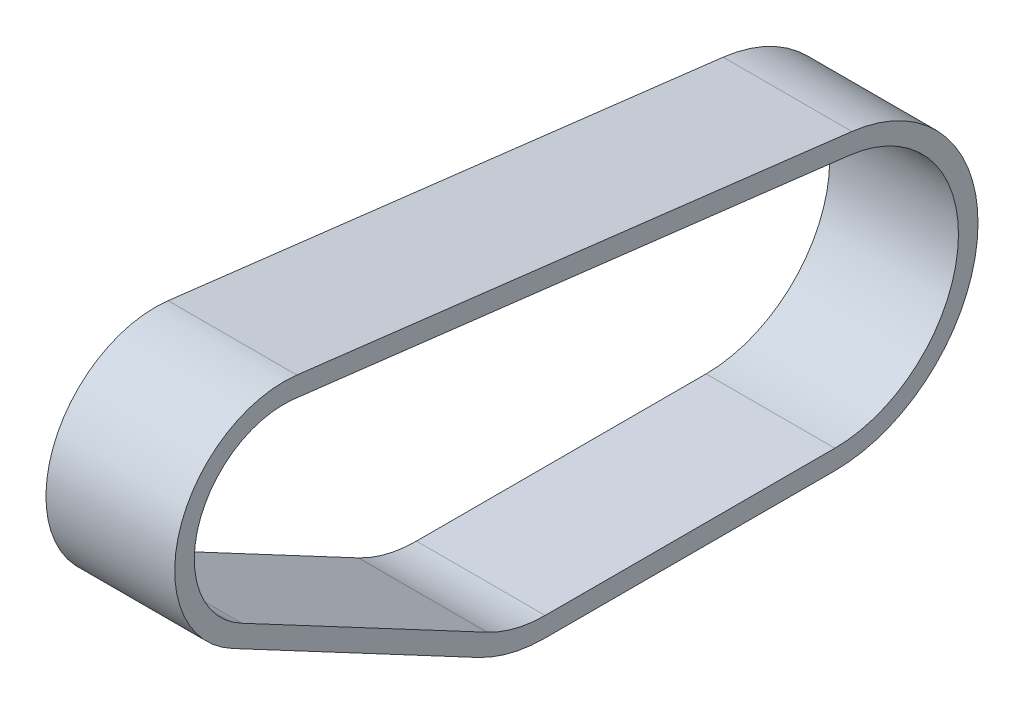
ISO-10303-21;
HEADER;
FILE_DESCRIPTION(('STEP AP214'),'2;1');
FILE_NAME('part.step','',(''),(''),'','','');
FILE_SCHEMA(('AUTOMOTIVE_DESIGN { 1 0 10303 214 1 1 1 1 }'));
ENDSEC;
DATA;
#1=APPLICATION_CONTEXT('core data for automotive mechanical design processes');
#2=APPLICATION_PROTOCOL_DEFINITION('international standard','automotive_design',2000,#1);
#3=PRODUCT_CONTEXT('',#1,'mechanical');
#4=PRODUCT('Part','Part','',(#3));
#5=PRODUCT_RELATED_PRODUCT_CATEGORY('part','',(#4));
#6=PRODUCT_DEFINITION_FORMATION('','',#4);
#7=PRODUCT_DEFINITION_CONTEXT('part definition',#1,'design');
#8=PRODUCT_DEFINITION('design','',#6,#7);
#9=PRODUCT_DEFINITION_SHAPE('','',#8);
#10=(LENGTH_UNIT() NAMED_UNIT(*) SI_UNIT(.MILLI.,.METRE.));
#11=(NAMED_UNIT(*) PLANE_ANGLE_UNIT() SI_UNIT($,.RADIAN.));
#12=(NAMED_UNIT(*) SI_UNIT($,.STERADIAN.) SOLID_ANGLE_UNIT());
#13=UNCERTAINTY_MEASURE_WITH_UNIT(LENGTH_MEASURE(1.E-05),#10,'distance_accuracy_value','');
#14=(GEOMETRIC_REPRESENTATION_CONTEXT(3) GLOBAL_UNCERTAINTY_ASSIGNED_CONTEXT((#13)) GLOBAL_UNIT_ASSIGNED_CONTEXT((#10,
#11,#12)) REPRESENTATION_CONTEXT('',''));
#15=CARTESIAN_POINT('',(0.,0.,0.));
#16=DIRECTION('',(0.,0.,1.));
#17=DIRECTION('',(1.,0.,0.));
#18=AXIS2_PLACEMENT_3D('',#15,#16,#17);
#19=CARTESIAN_POINT('',(-35.,-16.5000000000045,90.9999999999998));
#20=DIRECTION('',(1.,0.,0.));
#21=DIRECTION('',(0.,0.,-1.));
#22=AXIS2_PLACEMENT_3D('',#19,#20,#21);
#23=CYLINDRICAL_SURFACE('',#22,21.1918387948201);
#24=CARTESIAN_POINT('',(-10.,-16.5000000000045,90.9999999999998));
#25=DIRECTION('',(1.,0.,0.));
#26=DIRECTION('',(0.,0.,-1.));
#27=AXIS2_PLACEMENT_3D('',#24,#25,#26);
#28=CIRCLE('',#27,21.1918387948201);
#29=CARTESIAN_POINT('',(-10.,4.54078358631816,88.4742411874498));
#30=VERTEX_POINT('',#29);
#31=CARTESIAN_POINT('',(-10.,-35.2112908959066,100.948950925327));
#32=VERTEX_POINT('',#31);
#33=EDGE_CURVE('E167',#30,#32,#28,.T.);
#34=ORIENTED_EDGE('',*,*,#33,.F.);
#35=DIRECTION('',(1.,0.,0.));
#36=VECTOR('',#35,1.);
#37=CARTESIAN_POINT('',(-35.,4.54078358631816,88.4742411874498));
#38=LINE('',#37,#36);
#39=CARTESIAN_POINT('',(-35.,4.54078358631816,88.4742411874498));
#40=VERTEX_POINT('',#39);
#41=EDGE_CURVE('E11',#40,#30,#38,.T.);
#42=ORIENTED_EDGE('',*,*,#41,.F.);
#43=CARTESIAN_POINT('',(-35.,-16.5000000000045,90.9999999999998));
#44=DIRECTION('',(1.,0.,0.));
#45=DIRECTION('',(0.,0.,-1.));
#46=AXIS2_PLACEMENT_3D('',#43,#44,#45);
#47=CIRCLE('',#46,21.1918387948201);
#48=CARTESIAN_POINT('',(-35.,-35.2112908959066,100.948950925327));
#49=VERTEX_POINT('',#48);
#50=EDGE_CURVE('E175',#40,#49,#47,.T.);
#51=ORIENTED_EDGE('',*,*,#50,.T.);
#52=DIRECTION('',(1.,0.,0.));
#53=VECTOR('',#52,1.);
#54=CARTESIAN_POINT('',(-35.,-35.2112908959066,100.948950925327));
#55=LINE('',#54,#53);
#56=EDGE_CURVE('E36',#49,#32,#55,.T.);
#57=ORIENTED_EDGE('',*,*,#56,.T.);
#58=EDGE_LOOP('',(#34,#42,#51,#57));
#59=FACE_BOUND('',#58,.T.);
#60=ADVANCED_FACE('F33',(#59),#23,.T.);
#61=CARTESIAN_POINT('',(-35.,-8.39815811345562,-19.3133554699392));
#62=DIRECTION('',(0.,0.992872010307369,-0.11918544855897));
#63=DIRECTION('',(0.,0.11918544855897,0.992872010307369));
#64=AXIS2_PLACEMENT_3D('',#61,#62,#63);
#65=PLANE('',#64);
#66=DIRECTION('',(0.,0.11918544855897,0.992872010307369));
#67=VECTOR('',#66,1.);
#68=CARTESIAN_POINT('',(-10.,-8.39815811345562,-19.3133554699392));
#69=LINE('',#68,#67);
#70=CARTESIAN_POINT('',(-10.,-8.39815811345562,-19.3133554699392));
#71=VERTEX_POINT('',#70);
#72=EDGE_CURVE('E179',#71,#30,#69,.T.);
#73=ORIENTED_EDGE('',*,*,#72,.F.);
#74=DIRECTION('',(1.,0.,0.));
#75=VECTOR('',#74,1.);
#76=CARTESIAN_POINT('',(-35.,-8.39815811345562,-19.3133554699392));
#77=LINE('',#76,#75);
#78=CARTESIAN_POINT('',(-35.,-8.39815811345562,-19.3133554699392));
#79=VERTEX_POINT('',#78);
#80=EDGE_CURVE('E41',#79,#71,#77,.T.);
#81=ORIENTED_EDGE('',*,*,#80,.F.);
#82=DIRECTION('',(0.,0.11918544855897,0.992872010307369));
#83=VECTOR('',#82,1.);
#84=CARTESIAN_POINT('',(-35.,-8.39815811345562,-19.3133554699392));
#85=LINE('',#84,#83);
#86=EDGE_CURVE('E191',#79,#40,#85,.T.);
#87=ORIENTED_EDGE('',*,*,#86,.T.);
#88=ORIENTED_EDGE('',*,*,#41,.T.);
#89=EDGE_LOOP('',(#73,#81,#87,#88));
#90=FACE_BOUND('',#89,.T.);
#91=ADVANCED_FACE('F228',(#90),#65,.T.);
#92=CARTESIAN_POINT('',(-35.,-36.0000000000005,-16.0000000000001));
#93=DIRECTION('',(1.,0.,0.));
#94=DIRECTION('',(0.,0.,-1.));
#95=AXIS2_PLACEMENT_3D('',#92,#93,#94);
#96=CYLINDRICAL_SURFACE('',#95,27.8);
#97=CARTESIAN_POINT('',(-10.,-36.0000000000005,-16.0000000000001));
#98=DIRECTION('',(1.,0.,0.));
#99=DIRECTION('',(0.,0.,-1.));
#100=AXIS2_PLACEMENT_3D('',#97,#98,#99);
#101=CIRCLE('',#100,27.8);
#102=CARTESIAN_POINT('',(-10.,-63.8000000000005,-15.9999999999998));
#103=VERTEX_POINT('',#102);
#104=EDGE_CURVE('E205',#103,#71,#101,.T.);
#105=ORIENTED_EDGE('',*,*,#104,.F.);
#106=DIRECTION('',(1.,0.,0.));
#107=VECTOR('',#106,1.);
#108=CARTESIAN_POINT('',(-35.,-63.8000000000005,-15.9999999999998));
#109=LINE('',#108,#107);
#110=CARTESIAN_POINT('',(-35.,-63.8000000000005,-15.9999999999998));
#111=VERTEX_POINT('',#110);
#112=EDGE_CURVE('E211',#111,#103,#109,.T.);
#113=ORIENTED_EDGE('',*,*,#112,.F.);
#114=CARTESIAN_POINT('',(-35.,-36.0000000000005,-16.0000000000001));
#115=DIRECTION('',(1.,0.,0.));
#116=DIRECTION('',(0.,0.,-1.));
#117=AXIS2_PLACEMENT_3D('',#114,#115,#116);
#118=CIRCLE('',#117,27.8);
#119=EDGE_CURVE('E188',#111,#79,#118,.T.);
#120=ORIENTED_EDGE('',*,*,#119,.T.);
#121=ORIENTED_EDGE('',*,*,#80,.T.);
#122=EDGE_LOOP('',(#105,#113,#120,#121));
#123=FACE_BOUND('',#122,.T.);
#124=ADVANCED_FACE('F239',(#123),#96,.T.);
#125=CARTESIAN_POINT('',(-35.,-63.8000000000005,-15.9999999999998));
#126=DIRECTION('',(0.,-1.,0.));
#127=DIRECTION('',(0.,0.,-1.));
#128=AXIS2_PLACEMENT_3D('',#125,#126,#127);
#129=PLANE('',#128);
#130=DIRECTION('',(0.,0.,-1.));
#131=VECTOR('',#130,1.);
#132=CARTESIAN_POINT('',(-10.,-63.8000000000005,-15.9999999999998));
#133=LINE('',#132,#131);
#134=CARTESIAN_POINT('',(-10.,-63.8000000000017,40.2499999999996));
#135=VERTEX_POINT('',#134);
#136=EDGE_CURVE('E202',#135,#103,#133,.T.);
#137=ORIENTED_EDGE('',*,*,#136,.F.);
#138=DIRECTION('',(1.,0.,0.));
#139=VECTOR('',#138,1.);
#140=CARTESIAN_POINT('',(-35.,-63.8000000000017,40.2499999999996));
#141=LINE('',#140,#139);
#142=CARTESIAN_POINT('',(-35.,-63.8000000000017,40.2499999999996));
#143=VERTEX_POINT('',#142);
#144=EDGE_CURVE('E213',#143,#135,#141,.T.);
#145=ORIENTED_EDGE('',*,*,#144,.F.);
#146=DIRECTION('',(0.,0.,-1.));
#147=VECTOR('',#146,1.);
#148=CARTESIAN_POINT('',(-35.,-63.8000000000005,-15.9999999999998));
#149=LINE('',#148,#147);
#150=EDGE_CURVE('E185',#143,#111,#149,.T.);
#151=ORIENTED_EDGE('',*,*,#150,.T.);
#152=ORIENTED_EDGE('',*,*,#112,.T.);
#153=EDGE_LOOP('',(#137,#145,#151,#152));
#154=FACE_BOUND('',#153,.T.);
#155=ADVANCED_FACE('F237',(#154),#129,.T.);
#156=CARTESIAN_POINT('',(-35.,-36.0000000000029,40.2499999999996));
#157=DIRECTION('',(1.,0.,0.));
#158=DIRECTION('',(0.,0.,-1.));
#159=AXIS2_PLACEMENT_3D('',#156,#157,#158);
#160=CYLINDRICAL_SURFACE('',#159,27.7999999999988);
#161=CARTESIAN_POINT('',(-10.,-36.0000000000029,40.2499999999996));
#162=DIRECTION('',(1.,0.,0.));
#163=DIRECTION('',(0.,0.,1.));
#164=AXIS2_PLACEMENT_3D('',#161,#162,#163);
#165=CIRCLE('',#164,27.7999999999988);
#166=CARTESIAN_POINT('',(-10.,-60.5459533711263,53.3012900934159));
#167=VERTEX_POINT('',#166);
#168=EDGE_CURVE('E199',#167,#135,#165,.T.);
#169=ORIENTED_EDGE('',*,*,#168,.F.);
#170=DIRECTION('',(1.,0.,0.));
#171=VECTOR('',#170,1.);
#172=CARTESIAN_POINT('',(-35.,-60.5459533711263,53.3012900934159));
#173=LINE('',#172,#171);
#174=CARTESIAN_POINT('',(-35.,-60.5459533711263,53.3012900934159));
#175=VERTEX_POINT('',#174);
#176=EDGE_CURVE('E214',#175,#167,#173,.T.);
#177=ORIENTED_EDGE('',*,*,#176,.F.);
#178=CARTESIAN_POINT('',(-35.,-36.0000000000029,40.2499999999996));
#179=DIRECTION('',(1.,0.,0.));
#180=DIRECTION('',(0.,0.,1.));
#181=AXIS2_PLACEMENT_3D('',#178,#179,#180);
#182=CIRCLE('',#181,27.7999999999988);
#183=EDGE_CURVE('E182',#175,#143,#182,.T.);
#184=ORIENTED_EDGE('',*,*,#183,.T.);
#185=ORIENTED_EDGE('',*,*,#144,.T.);
#186=EDGE_LOOP('',(#169,#177,#184,#185));
#187=FACE_BOUND('',#186,.T.);
#188=ADVANCED_FACE('F234',(#187),#160,.T.);
#189=CARTESIAN_POINT('',(-35.,-35.2112908959066,100.948950925327));
#190=DIRECTION('',(0.,-0.882947962990153,0.469470866669637));
#191=DIRECTION('',(0.,-0.469470866669637,-0.882947962990153));
#192=AXIS2_PLACEMENT_3D('',#189,#190,#191);
#193=PLANE('',#192);
#194=DIRECTION('',(0.,-0.469470866669637,-0.882947962990153));
#195=VECTOR('',#194,1.);
#196=CARTESIAN_POINT('',(-10.,-35.2112908959066,100.948950925327));
#197=LINE('',#196,#195);
#198=EDGE_CURVE('E196',#32,#167,#197,.T.);
#199=ORIENTED_EDGE('',*,*,#198,.F.);
#200=ORIENTED_EDGE('',*,*,#56,.F.);
#201=DIRECTION('',(0.,-0.469470866669637,-0.882947962990153));
#202=VECTOR('',#201,1.);
#203=CARTESIAN_POINT('',(-35.,-35.2112908959066,100.948950925327));
#204=LINE('',#203,#202);
#205=EDGE_CURVE('E178',#49,#175,#204,.T.);
#206=ORIENTED_EDGE('',*,*,#205,.T.);
#207=ORIENTED_EDGE('',*,*,#176,.T.);
#208=EDGE_LOOP('',(#199,#200,#206,#207));
#209=FACE_BOUND('',#208,.T.);
#210=ADVANCED_FACE('F222',(#209),#193,.T.);
#211=CARTESIAN_POINT('',(-35.,-16.5000000000045,90.9999999999998));
#212=DIRECTION('',(1.,0.,0.));
#213=DIRECTION('',(0.,0.,-1.));
#214=AXIS2_PLACEMENT_3D('',#211,#212,#213);
#215=PLANE('',#214);
#216=DIRECTION('',(0.,0.11918544855897,0.992872010307369));
#217=VECTOR('',#216,1.);
#218=CARTESIAN_POINT('',(-35.,-12.1710717526236,-18.8604507654152));
#219=LINE('',#218,#217);
#220=CARTESIAN_POINT('',(-35.,-12.1710717526236,-18.8604507654152));
#221=VERTEX_POINT('',#220);
#222=CARTESIAN_POINT('',(-35.,0.767869947150158,88.9271458919739));
#223=VERTEX_POINT('',#222);
#224=EDGE_CURVE('E130',#221,#223,#219,.T.);
#225=ORIENTED_EDGE('',*,*,#224,.T.);
#226=CARTESIAN_POINT('',(-35.,-16.5000000000045,90.9999999999998));
#227=DIRECTION('',(1.,0.,0.));
#228=DIRECTION('',(0.,0.,-1.));
#229=AXIS2_PLACEMENT_3D('',#226,#227,#228);
#230=CIRCLE('',#229,17.3918387948201);
#231=CARTESIAN_POINT('',(-35.,-31.856088636544,99.1649616319826));
#232=VERTEX_POINT('',#231);
#233=EDGE_CURVE('E124',#223,#232,#230,.T.);
#234=ORIENTED_EDGE('',*,*,#233,.T.);
#235=DIRECTION('',(0.,-0.469470866669636,-0.882947962990153));
#236=VECTOR('',#235,1.);
#237=CARTESIAN_POINT('',(-35.,-31.856088636544,99.1649616319826));
#238=LINE('',#237,#236);
#239=CARTESIAN_POINT('',(-35.,-57.1907511117638,51.5173008000712));
#240=VERTEX_POINT('',#239);
#241=EDGE_CURVE('E133',#232,#240,#238,.T.);
#242=ORIENTED_EDGE('',*,*,#241,.T.);
#243=CARTESIAN_POINT('',(-35.,-36.0000000000029,40.2499999999996));
#244=DIRECTION('',(1.,0.,0.));
#245=DIRECTION('',(0.,0.,1.));
#246=AXIS2_PLACEMENT_3D('',#243,#244,#245);
#247=CIRCLE('',#246,23.9999999999974);
#248=CARTESIAN_POINT('',(-35.,-60.,40.2499999999996));
#249=VERTEX_POINT('',#248);
#250=EDGE_CURVE('E49',#240,#249,#247,.T.);
#251=ORIENTED_EDGE('',*,*,#250,.T.);
#252=DIRECTION('',(0.,0.,-1.));
#253=VECTOR('',#252,1.);
#254=CARTESIAN_POINT('',(-35.,-60.0000000000005,-15.9999999999998));
#255=LINE('',#254,#253);
#256=CARTESIAN_POINT('',(-35.,-60.0000000000005,-15.9999999999998));
#257=VERTEX_POINT('',#256);
#258=EDGE_CURVE('E148',#249,#257,#255,.T.);
#259=ORIENTED_EDGE('',*,*,#258,.T.);
#260=CARTESIAN_POINT('',(-35.,-36.0000000000005,-16.0000000000001));
#261=DIRECTION('',(1.,0.,0.));
#262=DIRECTION('',(0.,0.,-1.));
#263=AXIS2_PLACEMENT_3D('',#260,#261,#262);
#264=CIRCLE('',#263,24.);
#265=EDGE_CURVE('E151',#257,#221,#264,.T.);
#266=ORIENTED_EDGE('',*,*,#265,.T.);
#267=EDGE_LOOP('',(#225,#234,#242,#251,#259,#266));
#268=FACE_BOUND('',#267,.T.);
#269=ORIENTED_EDGE('',*,*,#50,.F.);
#270=ORIENTED_EDGE('',*,*,#86,.F.);
#271=ORIENTED_EDGE('',*,*,#119,.F.);
#272=ORIENTED_EDGE('',*,*,#150,.F.);
#273=ORIENTED_EDGE('',*,*,#183,.F.);
#274=ORIENTED_EDGE('',*,*,#205,.F.);
#275=EDGE_LOOP('',(#269,#270,#271,#272,#273,#274));
#276=FACE_BOUND('',#275,.T.);
#277=ADVANCED_FACE('F137',(#268,#276),#215,.F.);
#278=CARTESIAN_POINT('',(-10.,-16.5000000000045,90.9999999999998));
#279=DIRECTION('',(1.,0.,0.));
#280=DIRECTION('',(0.,0.,-1.));
#281=AXIS2_PLACEMENT_3D('',#278,#279,#280);
#282=PLANE('',#281);
#283=CARTESIAN_POINT('',(-10.,-16.5000000000045,90.9999999999998));
#284=DIRECTION('',(1.,0.,0.));
#285=DIRECTION('',(0.,0.,-1.));
#286=AXIS2_PLACEMENT_3D('',#283,#284,#285);
#287=CIRCLE('',#286,17.3918387948201);
#288=CARTESIAN_POINT('',(-10.,0.767869947150158,88.9271458919739));
#289=VERTEX_POINT('',#288);
#290=CARTESIAN_POINT('',(-10.,-31.856088636544,99.1649616319826));
#291=VERTEX_POINT('',#290);
#292=EDGE_CURVE('E57',#289,#291,#287,.T.);
#293=ORIENTED_EDGE('',*,*,#292,.F.);
#294=DIRECTION('',(0.,0.11918544855897,0.992872010307369));
#295=VECTOR('',#294,1.);
#296=CARTESIAN_POINT('',(-10.,-12.1710717526236,-18.8604507654152));
#297=LINE('',#296,#295);
#298=CARTESIAN_POINT('',(-10.,-12.1710717526236,-18.8604507654152));
#299=VERTEX_POINT('',#298);
#300=EDGE_CURVE('E141',#299,#289,#297,.T.);
#301=ORIENTED_EDGE('',*,*,#300,.F.);
#302=CARTESIAN_POINT('',(-10.,-36.0000000000005,-16.0000000000001));
#303=DIRECTION('',(1.,0.,0.));
#304=DIRECTION('',(0.,0.,-1.));
#305=AXIS2_PLACEMENT_3D('',#302,#303,#304);
#306=CIRCLE('',#305,24.);
#307=CARTESIAN_POINT('',(-10.,-60.0000000000005,-15.9999999999998));
#308=VERTEX_POINT('',#307);
#309=EDGE_CURVE('E144',#308,#299,#306,.T.);
#310=ORIENTED_EDGE('',*,*,#309,.F.);
#311=DIRECTION('',(0.,0.,-1.));
#312=VECTOR('',#311,1.);
#313=CARTESIAN_POINT('',(-10.,-60.0000000000005,-15.9999999999998));
#314=LINE('',#313,#312);
#315=CARTESIAN_POINT('',(-10.,-60.,40.2499999999996));
#316=VERTEX_POINT('',#315);
#317=EDGE_CURVE('E160',#316,#308,#314,.T.);
#318=ORIENTED_EDGE('',*,*,#317,.F.);
#319=CARTESIAN_POINT('',(-10.,-36.0000000000029,40.2499999999996));
#320=DIRECTION('',(1.,0.,0.));
#321=DIRECTION('',(0.,0.,1.));
#322=AXIS2_PLACEMENT_3D('',#319,#320,#321);
#323=CIRCLE('',#322,23.9999999999974);
#324=CARTESIAN_POINT('',(-10.,-57.1907511117634,51.5173008000712));
#325=VERTEX_POINT('',#324);
#326=EDGE_CURVE('E157',#325,#316,#323,.T.);
#327=ORIENTED_EDGE('',*,*,#326,.F.);
#328=DIRECTION('',(0.,-0.469470866669636,-0.882947962990153));
#329=VECTOR('',#328,1.);
#330=CARTESIAN_POINT('',(-10.,-31.856088636544,99.1649616319826));
#331=LINE('',#330,#329);
#332=EDGE_CURVE('E155',#291,#325,#331,.T.);
#333=ORIENTED_EDGE('',*,*,#332,.F.);
#334=EDGE_LOOP('',(#293,#301,#310,#318,#327,#333));
#335=FACE_BOUND('',#334,.T.);
#336=ORIENTED_EDGE('',*,*,#33,.T.);
#337=ORIENTED_EDGE('',*,*,#198,.T.);
#338=ORIENTED_EDGE('',*,*,#168,.T.);
#339=ORIENTED_EDGE('',*,*,#136,.T.);
#340=ORIENTED_EDGE('',*,*,#104,.T.);
#341=ORIENTED_EDGE('',*,*,#72,.T.);
#342=EDGE_LOOP('',(#336,#337,#338,#339,#340,#341));
#343=FACE_BOUND('',#342,.T.);
#344=ADVANCED_FACE('F224',(#335,#343),#282,.T.);
#345=CARTESIAN_POINT('',(-35.,-16.5000000000045,90.9999999999998));
#346=DIRECTION('',(1.,0.,0.));
#347=DIRECTION('',(0.,0.,-1.));
#348=AXIS2_PLACEMENT_3D('',#345,#346,#347);
#349=CYLINDRICAL_SURFACE('',#348,17.3918387948201);
#350=ORIENTED_EDGE('',*,*,#292,.T.);
#351=DIRECTION('',(1.,0.,0.));
#352=VECTOR('',#351,1.);
#353=CARTESIAN_POINT('',(-35.,-31.856088636544,99.1649616319826));
#354=LINE('',#353,#352);
#355=EDGE_CURVE('E120',#232,#291,#354,.T.);
#356=ORIENTED_EDGE('',*,*,#355,.F.);
#357=ORIENTED_EDGE('',*,*,#233,.F.);
#358=DIRECTION('',(1.,0.,0.));
#359=VECTOR('',#358,1.);
#360=CARTESIAN_POINT('',(-35.,0.767869947150158,88.9271458919739));
#361=LINE('',#360,#359);
#362=EDGE_CURVE('E165',#223,#289,#361,.T.);
#363=ORIENTED_EDGE('',*,*,#362,.T.);
#364=EDGE_LOOP('',(#350,#356,#357,#363));
#365=FACE_BOUND('',#364,.T.);
#366=ADVANCED_FACE('F122',(#365),#349,.F.);
#367=CARTESIAN_POINT('',(-35.,-12.1710717526236,-18.8604507654152));
#368=DIRECTION('',(0.,0.992872010307369,-0.11918544855897));
#369=DIRECTION('',(0.,0.11918544855897,0.992872010307369));
#370=AXIS2_PLACEMENT_3D('',#367,#368,#369);
#371=PLANE('',#370);
#372=ORIENTED_EDGE('',*,*,#300,.T.);
#373=ORIENTED_EDGE('',*,*,#362,.F.);
#374=ORIENTED_EDGE('',*,*,#224,.F.);
#375=DIRECTION('',(1.,0.,0.));
#376=VECTOR('',#375,1.);
#377=CARTESIAN_POINT('',(-35.,-12.1710717526236,-18.8604507654152));
#378=LINE('',#377,#376);
#379=EDGE_CURVE('E168',#221,#299,#378,.T.);
#380=ORIENTED_EDGE('',*,*,#379,.T.);
#381=EDGE_LOOP('',(#372,#373,#374,#380));
#382=FACE_BOUND('',#381,.T.);
#383=ADVANCED_FACE('F306',(#382),#371,.F.);
#384=CARTESIAN_POINT('',(-35.,-36.0000000000005,-16.0000000000001));
#385=DIRECTION('',(1.,0.,0.));
#386=DIRECTION('',(0.,0.,-1.));
#387=AXIS2_PLACEMENT_3D('',#384,#385,#386);
#388=CYLINDRICAL_SURFACE('',#387,24.);
#389=ORIENTED_EDGE('',*,*,#309,.T.);
#390=ORIENTED_EDGE('',*,*,#379,.F.);
#391=ORIENTED_EDGE('',*,*,#265,.F.);
#392=DIRECTION('',(1.,0.,0.));
#393=VECTOR('',#392,1.);
#394=CARTESIAN_POINT('',(-35.,-60.0000000000005,-15.9999999999998));
#395=LINE('',#394,#393);
#396=EDGE_CURVE('E170',#257,#308,#395,.T.);
#397=ORIENTED_EDGE('',*,*,#396,.T.);
#398=EDGE_LOOP('',(#389,#390,#391,#397));
#399=FACE_BOUND('',#398,.T.);
#400=ADVANCED_FACE('F315',(#399),#388,.F.);
#401=CARTESIAN_POINT('',(-35.,-60.0000000000005,-15.9999999999998));
#402=DIRECTION('',(0.,-1.,0.));
#403=DIRECTION('',(0.,0.,-1.));
#404=AXIS2_PLACEMENT_3D('',#401,#402,#403);
#405=PLANE('',#404);
#406=ORIENTED_EDGE('',*,*,#317,.T.);
#407=ORIENTED_EDGE('',*,*,#396,.F.);
#408=ORIENTED_EDGE('',*,*,#258,.F.);
#409=DIRECTION('',(1.,0.,0.));
#410=VECTOR('',#409,1.);
#411=CARTESIAN_POINT('',(-35.,-60.,40.2499999999996));
#412=LINE('',#411,#410);
#413=EDGE_CURVE('E172',#249,#316,#412,.T.);
#414=ORIENTED_EDGE('',*,*,#413,.T.);
#415=EDGE_LOOP('',(#406,#407,#408,#414));
#416=FACE_BOUND('',#415,.T.);
#417=ADVANCED_FACE('F325',(#416),#405,.F.);
#418=CARTESIAN_POINT('',(-35.,-36.0000000000029,40.2499999999996));
#419=DIRECTION('',(1.,0.,0.));
#420=DIRECTION('',(0.,0.,-1.));
#421=AXIS2_PLACEMENT_3D('',#418,#419,#420);
#422=CYLINDRICAL_SURFACE('',#421,23.9999999999974);
#423=ORIENTED_EDGE('',*,*,#326,.T.);
#424=ORIENTED_EDGE('',*,*,#413,.F.);
#425=ORIENTED_EDGE('',*,*,#250,.F.);
#426=DIRECTION('',(1.,0.,0.));
#427=VECTOR('',#426,1.);
#428=CARTESIAN_POINT('',(-35.,-57.1907511117634,51.5173008000712));
#429=LINE('',#428,#427);
#430=EDGE_CURVE('E129',#240,#325,#429,.T.);
#431=ORIENTED_EDGE('',*,*,#430,.T.);
#432=EDGE_LOOP('',(#423,#424,#425,#431));
#433=FACE_BOUND('',#432,.T.);
#434=ADVANCED_FACE('F335',(#433),#422,.F.);
#435=CARTESIAN_POINT('',(-35.,-31.856088636544,99.1649616319826));
#436=DIRECTION('',(0.,-0.882947962990153,0.469470866669636));
#437=DIRECTION('',(0.,-0.469470866669637,-0.882947962990153));
#438=AXIS2_PLACEMENT_3D('',#435,#436,#437);
#439=PLANE('',#438);
#440=ORIENTED_EDGE('',*,*,#332,.T.);
#441=ORIENTED_EDGE('',*,*,#430,.F.);
#442=ORIENTED_EDGE('',*,*,#241,.F.);
#443=ORIENTED_EDGE('',*,*,#355,.T.);
#444=EDGE_LOOP('',(#440,#441,#442,#443));
#445=FACE_BOUND('',#444,.T.);
#446=ADVANCED_FACE('F134',(#445),#439,.F.);
#447=CLOSED_SHELL('',(#60,#91,#124,#155,#188,#210,#277,#344,#366,#383,#400,#417,#434,#446));
#448=MANIFOLD_SOLID_BREP('B2',#447);
#449=ADVANCED_BREP_SHAPE_REPRESENTATION('',(#18,#448),#14);
#450=SHAPE_DEFINITION_REPRESENTATION(#9,#449);
ENDSEC;
END-ISO-10303-21;
